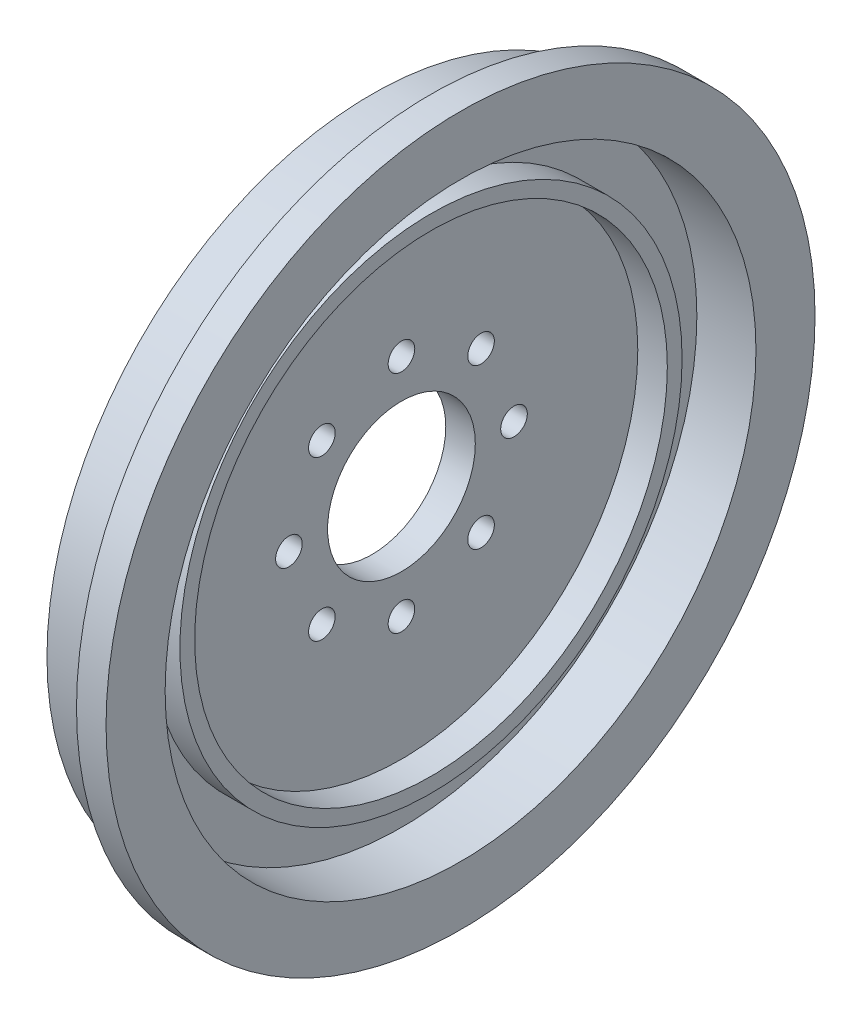
ISO-10303-21;
HEADER;
FILE_DESCRIPTION(('STEP AP214'),'2;1');
FILE_NAME('part.step','',(''),(''),'','','');
FILE_SCHEMA(('AUTOMOTIVE_DESIGN { 1 0 10303 214 1 1 1 1 }'));
ENDSEC;
DATA;
#1=APPLICATION_CONTEXT('core data for automotive mechanical design processes');
#2=APPLICATION_PROTOCOL_DEFINITION('international standard','automotive_design',2000,#1);
#3=PRODUCT_CONTEXT('',#1,'mechanical');
#4=PRODUCT('Part','Part','',(#3));
#5=PRODUCT_RELATED_PRODUCT_CATEGORY('part','',(#4));
#6=PRODUCT_DEFINITION_FORMATION('','',#4);
#7=PRODUCT_DEFINITION_CONTEXT('part definition',#1,'design');
#8=PRODUCT_DEFINITION('design','',#6,#7);
#9=PRODUCT_DEFINITION_SHAPE('','',#8);
#10=(LENGTH_UNIT() NAMED_UNIT(*) SI_UNIT(.MILLI.,.METRE.));
#11=(NAMED_UNIT(*) PLANE_ANGLE_UNIT() SI_UNIT($,.RADIAN.));
#12=(NAMED_UNIT(*) SI_UNIT($,.STERADIAN.) SOLID_ANGLE_UNIT());
#13=UNCERTAINTY_MEASURE_WITH_UNIT(LENGTH_MEASURE(1.E-05),#10,'distance_accuracy_value','');
#14=(GEOMETRIC_REPRESENTATION_CONTEXT(3) GLOBAL_UNCERTAINTY_ASSIGNED_CONTEXT((#13)) GLOBAL_UNIT_ASSIGNED_CONTEXT((#10,
#11,#12)) REPRESENTATION_CONTEXT('',''));
#15=CARTESIAN_POINT('',(0.,0.,0.));
#16=DIRECTION('',(0.,0.,1.));
#17=DIRECTION('',(1.,0.,0.));
#18=AXIS2_PLACEMENT_3D('',#15,#16,#17);
#19=CARTESIAN_POINT('',(0.,0.,0.));
#20=DIRECTION('',(1.,0.,0.));
#21=DIRECTION('',(0.,0.,-1.));
#22=AXIS2_PLACEMENT_3D('',#19,#20,#21);
#23=PLANE('',#22);
#24=CARTESIAN_POINT('',(0.,26.9407683632078,26.9407683632071));
#25=DIRECTION('',(1.,0.,0.));
#26=DIRECTION('',(0.,0.,-1.));
#27=AXIS2_PLACEMENT_3D('',#24,#25,#26);
#28=CIRCLE('',#27,4.49999999999999);
#29=CARTESIAN_POINT('',(0.,26.9407683632078,22.4407683632071));
#30=VERTEX_POINT('',#29);
#31=EDGE_CURVE('E81',#30,#30,#28,.T.);
#32=ORIENTED_EDGE('',*,*,#31,.T.);
#33=EDGE_LOOP('',(#32));
#34=FACE_BOUND('',#33,.T.);
#35=CARTESIAN_POINT('',(0.,26.9407683632074,-26.9407683632075));
#36=DIRECTION('',(1.,0.,0.));
#37=DIRECTION('',(0.,0.,-1.));
#38=AXIS2_PLACEMENT_3D('',#35,#36,#37);
#39=CIRCLE('',#38,4.5);
#40=CARTESIAN_POINT('',(0.,26.9407683632074,-31.4407683632075));
#41=VERTEX_POINT('',#40);
#42=EDGE_CURVE('E123',#41,#41,#39,.T.);
#43=ORIENTED_EDGE('',*,*,#42,.T.);
#44=EDGE_LOOP('',(#43));
#45=FACE_BOUND('',#44,.T.);
#46=CARTESIAN_POINT('',(0.,3.9907631702977E-13,38.1));
#47=DIRECTION('',(1.,0.,0.));
#48=DIRECTION('',(0.,0.,-1.));
#49=AXIS2_PLACEMENT_3D('',#46,#47,#48);
#50=CIRCLE('',#49,4.5);
#51=CARTESIAN_POINT('',(0.,3.9907631702977E-13,33.6));
#52=VERTEX_POINT('',#51);
#53=EDGE_CURVE('E132',#52,#52,#50,.T.);
#54=ORIENTED_EDGE('',*,*,#53,.T.);
#55=EDGE_LOOP('',(#54));
#56=FACE_BOUND('',#55,.T.);
#57=CARTESIAN_POINT('',(0.,-26.9407683632072,26.9407683632077));
#58=DIRECTION('',(1.,0.,0.));
#59=DIRECTION('',(0.,0.,-1.));
#60=AXIS2_PLACEMENT_3D('',#57,#58,#59);
#61=CIRCLE('',#60,4.5);
#62=CARTESIAN_POINT('',(0.,-26.9407683632072,22.4407683632077));
#63=VERTEX_POINT('',#62);
#64=EDGE_CURVE('E140',#63,#63,#61,.T.);
#65=ORIENTED_EDGE('',*,*,#64,.T.);
#66=EDGE_LOOP('',(#65));
#67=FACE_BOUND('',#66,.T.);
#68=CARTESIAN_POINT('',(0.,-38.1,2.66050878019847E-13));
#69=DIRECTION('',(1.,0.,0.));
#70=DIRECTION('',(0.,0.,-1.));
#71=AXIS2_PLACEMENT_3D('',#68,#69,#70);
#72=CIRCLE('',#71,4.5);
#73=CARTESIAN_POINT('',(0.,-38.1,-4.49999999999973));
#74=VERTEX_POINT('',#73);
#75=EDGE_CURVE('E91',#74,#74,#72,.T.);
#76=ORIENTED_EDGE('',*,*,#75,.T.);
#77=EDGE_LOOP('',(#76));
#78=FACE_BOUND('',#77,.T.);
#79=CARTESIAN_POINT('',(0.,-26.9407683632076,-26.9407683632073));
#80=DIRECTION('',(1.,0.,0.));
#81=DIRECTION('',(0.,0.,-1.));
#82=AXIS2_PLACEMENT_3D('',#79,#80,#81);
#83=CIRCLE('',#82,4.5);
#84=CARTESIAN_POINT('',(0.,-26.9407683632076,-31.4407683632073));
#85=VERTEX_POINT('',#84);
#86=EDGE_CURVE('E100',#85,#85,#83,.T.);
#87=ORIENTED_EDGE('',*,*,#86,.T.);
#88=EDGE_LOOP('',(#87));
#89=FACE_BOUND('',#88,.T.);
#90=CARTESIAN_POINT('',(0.,-1.33025439009923E-13,-38.1));
#91=DIRECTION('',(1.,0.,0.));
#92=DIRECTION('',(0.,0.,-1.));
#93=AXIS2_PLACEMENT_3D('',#90,#91,#92);
#94=CIRCLE('',#93,4.5);
#95=CARTESIAN_POINT('',(0.,-1.33025439009923E-13,-42.6));
#96=VERTEX_POINT('',#95);
#97=EDGE_CURVE('E108',#96,#96,#94,.T.);
#98=ORIENTED_EDGE('',*,*,#97,.T.);
#99=EDGE_LOOP('',(#98));
#100=FACE_BOUND('',#99,.T.);
#101=CARTESIAN_POINT('',(0.,38.1,0.));
#102=DIRECTION('',(1.,0.,0.));
#103=DIRECTION('',(0.,0.,-1.));
#104=AXIS2_PLACEMENT_3D('',#101,#102,#103);
#105=CIRCLE('',#104,4.5);
#106=CARTESIAN_POINT('',(0.,38.1,-4.5));
#107=VERTEX_POINT('',#106);
#108=EDGE_CURVE('E116',#107,#107,#105,.T.);
#109=ORIENTED_EDGE('',*,*,#108,.T.);
#110=EDGE_LOOP('',(#109));
#111=FACE_BOUND('',#110,.T.);
#112=CARTESIAN_POINT('',(0.,0.,0.));
#113=DIRECTION('',(1.,0.,0.));
#114=DIRECTION('',(0.,0.,-1.));
#115=AXIS2_PLACEMENT_3D('',#112,#113,#114);
#116=CIRCLE('',#115,25.);
#117=CARTESIAN_POINT('',(0.,0.,-25.));
#118=VERTEX_POINT('',#117);
#119=EDGE_CURVE('E128',#118,#118,#116,.T.);
#120=ORIENTED_EDGE('',*,*,#119,.T.);
#121=EDGE_LOOP('',(#120));
#122=FACE_BOUND('',#121,.T.);
#123=CARTESIAN_POINT('',(0.,0.,0.));
#124=DIRECTION('',(1.,0.,0.));
#125=DIRECTION('',(0.,0.,-1.));
#126=AXIS2_PLACEMENT_3D('',#123,#124,#125);
#127=CIRCLE('',#126,110.);
#128=CARTESIAN_POINT('',(0.,0.,-110.));
#129=VERTEX_POINT('',#128);
#130=EDGE_CURVE('E170',#129,#129,#127,.T.);
#131=ORIENTED_EDGE('',*,*,#130,.F.);
#132=EDGE_LOOP('',(#131));
#133=FACE_BOUND('',#132,.T.);
#134=ADVANCED_FACE('F58',(#34,#45,#56,#67,#78,#89,#100,#111,#122,#133),#23,.F.);
#135=CARTESIAN_POINT('',(10.,0.,0.));
#136=DIRECTION('',(1.,0.,0.));
#137=DIRECTION('',(0.,0.,-1.));
#138=AXIS2_PLACEMENT_3D('',#135,#136,#137);
#139=PLANE('',#138);
#140=CARTESIAN_POINT('',(10.,26.9407683632078,26.9407683632071));
#141=DIRECTION('',(1.,0.,0.));
#142=DIRECTION('',(0.,0.,-1.));
#143=AXIS2_PLACEMENT_3D('',#140,#141,#142);
#144=CIRCLE('',#143,4.49999999999999);
#145=CARTESIAN_POINT('',(10.,26.9407683632078,22.4407683632071));
#146=VERTEX_POINT('',#145);
#147=EDGE_CURVE('E83',#146,#146,#144,.T.);
#148=ORIENTED_EDGE('',*,*,#147,.F.);
#149=EDGE_LOOP('',(#148));
#150=FACE_BOUND('',#149,.T.);
#151=CARTESIAN_POINT('',(10.,26.9407683632074,-26.9407683632075));
#152=DIRECTION('',(1.,0.,0.));
#153=DIRECTION('',(0.,0.,-1.));
#154=AXIS2_PLACEMENT_3D('',#151,#152,#153);
#155=CIRCLE('',#154,4.5);
#156=CARTESIAN_POINT('',(10.,26.9407683632074,-31.4407683632075));
#157=VERTEX_POINT('',#156);
#158=EDGE_CURVE('E127',#157,#157,#155,.T.);
#159=ORIENTED_EDGE('',*,*,#158,.F.);
#160=EDGE_LOOP('',(#159));
#161=FACE_BOUND('',#160,.T.);
#162=CARTESIAN_POINT('',(10.,3.9907631702977E-13,38.1));
#163=DIRECTION('',(1.,0.,0.));
#164=DIRECTION('',(0.,0.,-1.));
#165=AXIS2_PLACEMENT_3D('',#162,#163,#164);
#166=CIRCLE('',#165,4.5);
#167=CARTESIAN_POINT('',(10.,3.9907631702977E-13,33.6));
#168=VERTEX_POINT('',#167);
#169=EDGE_CURVE('E136',#168,#168,#166,.T.);
#170=ORIENTED_EDGE('',*,*,#169,.F.);
#171=EDGE_LOOP('',(#170));
#172=FACE_BOUND('',#171,.T.);
#173=CARTESIAN_POINT('',(10.,-26.9407683632072,26.9407683632077));
#174=DIRECTION('',(1.,0.,0.));
#175=DIRECTION('',(0.,0.,-1.));
#176=AXIS2_PLACEMENT_3D('',#173,#174,#175);
#177=CIRCLE('',#176,4.5);
#178=CARTESIAN_POINT('',(10.,-26.9407683632072,22.4407683632077));
#179=VERTEX_POINT('',#178);
#180=EDGE_CURVE('E96',#179,#179,#177,.T.);
#181=ORIENTED_EDGE('',*,*,#180,.F.);
#182=EDGE_LOOP('',(#181));
#183=FACE_BOUND('',#182,.T.);
#184=CARTESIAN_POINT('',(10.,-38.1,2.66050878019847E-13));
#185=DIRECTION('',(1.,0.,0.));
#186=DIRECTION('',(0.,0.,-1.));
#187=AXIS2_PLACEMENT_3D('',#184,#185,#186);
#188=CIRCLE('',#187,4.5);
#189=CARTESIAN_POINT('',(10.,-38.1,-4.49999999999973));
#190=VERTEX_POINT('',#189);
#191=EDGE_CURVE('E95',#190,#190,#188,.T.);
#192=ORIENTED_EDGE('',*,*,#191,.F.);
#193=EDGE_LOOP('',(#192));
#194=FACE_BOUND('',#193,.T.);
#195=CARTESIAN_POINT('',(10.,-26.9407683632076,-26.9407683632073));
#196=DIRECTION('',(1.,0.,0.));
#197=DIRECTION('',(0.,0.,-1.));
#198=AXIS2_PLACEMENT_3D('',#195,#196,#197);
#199=CIRCLE('',#198,4.5);
#200=CARTESIAN_POINT('',(10.,-26.9407683632076,-31.4407683632073));
#201=VERTEX_POINT('',#200);
#202=EDGE_CURVE('E104',#201,#201,#199,.T.);
#203=ORIENTED_EDGE('',*,*,#202,.F.);
#204=EDGE_LOOP('',(#203));
#205=FACE_BOUND('',#204,.T.);
#206=CARTESIAN_POINT('',(10.,-1.33025439009923E-13,-38.1));
#207=DIRECTION('',(1.,0.,0.));
#208=DIRECTION('',(0.,0.,-1.));
#209=AXIS2_PLACEMENT_3D('',#206,#207,#208);
#210=CIRCLE('',#209,4.5);
#211=CARTESIAN_POINT('',(10.,-1.33025439009923E-13,-42.6));
#212=VERTEX_POINT('',#211);
#213=EDGE_CURVE('E112',#212,#212,#210,.T.);
#214=ORIENTED_EDGE('',*,*,#213,.F.);
#215=EDGE_LOOP('',(#214));
#216=FACE_BOUND('',#215,.T.);
#217=CARTESIAN_POINT('',(10.,38.1,0.));
#218=DIRECTION('',(1.,0.,0.));
#219=DIRECTION('',(0.,0.,-1.));
#220=AXIS2_PLACEMENT_3D('',#217,#218,#219);
#221=CIRCLE('',#220,4.5);
#222=CARTESIAN_POINT('',(10.,38.1,-4.5));
#223=VERTEX_POINT('',#222);
#224=EDGE_CURVE('E87',#223,#223,#221,.T.);
#225=ORIENTED_EDGE('',*,*,#224,.F.);
#226=EDGE_LOOP('',(#225));
#227=FACE_BOUND('',#226,.T.);
#228=CARTESIAN_POINT('',(10.,0.,0.));
#229=DIRECTION('',(1.,0.,0.));
#230=DIRECTION('',(0.,0.,-1.));
#231=AXIS2_PLACEMENT_3D('',#228,#229,#230);
#232=CIRCLE('',#231,25.);
#233=CARTESIAN_POINT('',(10.,0.,-25.));
#234=VERTEX_POINT('',#233);
#235=EDGE_CURVE('E147',#234,#234,#232,.T.);
#236=ORIENTED_EDGE('',*,*,#235,.F.);
#237=EDGE_LOOP('',(#236));
#238=FACE_BOUND('',#237,.T.);
#239=CARTESIAN_POINT('',(10.,0.,0.));
#240=DIRECTION('',(1.,0.,0.));
#241=DIRECTION('',(0.,0.,-1.));
#242=AXIS2_PLACEMENT_3D('',#239,#240,#241);
#243=CIRCLE('',#242,80.);
#244=CARTESIAN_POINT('',(10.,0.,-80.));
#245=VERTEX_POINT('',#244);
#246=EDGE_CURVE('E11',#245,#245,#243,.F.);
#247=ORIENTED_EDGE('',*,*,#246,.F.);
#248=EDGE_LOOP('',(#247));
#249=FACE_BOUND('',#248,.T.);
#250=ADVANCED_FACE('F183',(#150,#161,#172,#183,#194,#205,#216,#227,#238,#249),#139,.T.);
#251=CARTESIAN_POINT('',(30.,0.,0.));
#252=DIRECTION('',(-1.,0.,0.));
#253=DIRECTION('',(0.,0.,1.));
#254=AXIS2_PLACEMENT_3D('',#251,#252,#253);
#255=CYLINDRICAL_SURFACE('',#254,120.);
#256=CARTESIAN_POINT('',(20.,0.,0.));
#257=DIRECTION('',(1.,0.,0.));
#258=DIRECTION('',(0.,0.,-1.));
#259=AXIS2_PLACEMENT_3D('',#256,#257,#258);
#260=CIRCLE('',#259,120.);
#261=CARTESIAN_POINT('',(20.,0.,-120.));
#262=VERTEX_POINT('',#261);
#263=EDGE_CURVE('E166',#262,#262,#260,.T.);
#264=ORIENTED_EDGE('',*,*,#263,.T.);
#265=EDGE_LOOP('',(#264));
#266=FACE_BOUND('',#265,.T.);
#267=CARTESIAN_POINT('',(30.,0.,0.));
#268=DIRECTION('',(1.,0.,0.));
#269=DIRECTION('',(0.,0.,-1.));
#270=AXIS2_PLACEMENT_3D('',#267,#268,#269);
#271=CIRCLE('',#270,120.);
#272=CARTESIAN_POINT('',(30.,0.,-120.));
#273=VERTEX_POINT('',#272);
#274=EDGE_CURVE('E66',#273,#273,#271,.T.);
#275=ORIENTED_EDGE('',*,*,#274,.F.);
#276=EDGE_LOOP('',(#275));
#277=FACE_BOUND('',#276,.T.);
#278=ADVANCED_FACE('F60',(#266,#277),#255,.T.);
#279=CARTESIAN_POINT('',(30.,0.,0.));
#280=DIRECTION('',(1.,0.,0.));
#281=DIRECTION('',(0.,0.,-1.));
#282=AXIS2_PLACEMENT_3D('',#279,#280,#281);
#283=PLANE('',#282);
#284=CARTESIAN_POINT('',(30.,0.,0.));
#285=DIRECTION('',(1.,0.,0.));
#286=DIRECTION('',(0.,0.,-1.));
#287=AXIS2_PLACEMENT_3D('',#284,#285,#286);
#288=CIRCLE('',#287,100.);
#289=CARTESIAN_POINT('',(30.,0.,-100.));
#290=VERTEX_POINT('',#289);
#291=EDGE_CURVE('E76',#290,#290,#288,.T.);
#292=ORIENTED_EDGE('',*,*,#291,.F.);
#293=EDGE_LOOP('',(#292));
#294=FACE_BOUND('',#293,.T.);
#295=ORIENTED_EDGE('',*,*,#274,.T.);
#296=EDGE_LOOP('',(#295));
#297=FACE_BOUND('',#296,.T.);
#298=ADVANCED_FACE('F195',(#294,#297),#283,.T.);
#299=CARTESIAN_POINT('',(10.,0.,0.));
#300=DIRECTION('',(1.,0.,0.));
#301=DIRECTION('',(0.,0.,-1.));
#302=AXIS2_PLACEMENT_3D('',#299,#300,#301);
#303=CYLINDRICAL_SURFACE('',#302,100.);
#304=CARTESIAN_POINT('',(10.,0.,0.));
#305=DIRECTION('',(1.,0.,0.));
#306=DIRECTION('',(0.,0.,-1.));
#307=AXIS2_PLACEMENT_3D('',#304,#305,#306);
#308=CIRCLE('',#307,100.);
#309=CARTESIAN_POINT('',(10.,0.,-100.));
#310=VERTEX_POINT('',#309);
#311=EDGE_CURVE('E71',#310,#310,#308,.T.);
#312=ORIENTED_EDGE('',*,*,#311,.F.);
#313=EDGE_LOOP('',(#312));
#314=FACE_BOUND('',#313,.T.);
#315=ORIENTED_EDGE('',*,*,#291,.T.);
#316=EDGE_LOOP('',(#315));
#317=FACE_BOUND('',#316,.T.);
#318=ADVANCED_FACE('F198',(#314,#317),#303,.F.);
#319=CARTESIAN_POINT('',(10.,0.,0.));
#320=DIRECTION('',(1.,0.,0.));
#321=DIRECTION('',(0.,0.,-1.));
#322=AXIS2_PLACEMENT_3D('',#319,#320,#321);
#323=CIRCLE('',#322,85.);
#324=CARTESIAN_POINT('',(10.,0.,-85.));
#325=VERTEX_POINT('',#324);
#326=EDGE_CURVE('E155',#325,#325,#323,.T.);
#327=ORIENTED_EDGE('',*,*,#326,.F.);
#328=EDGE_LOOP('',(#327));
#329=FACE_BOUND('',#328,.T.);
#330=ORIENTED_EDGE('',*,*,#311,.T.);
#331=EDGE_LOOP('',(#330));
#332=FACE_BOUND('',#331,.T.);
#333=ADVANCED_FACE('F192',(#329,#332),#139,.T.);
#334=CARTESIAN_POINT('',(0.,26.9407683632078,26.9407683632071));
#335=DIRECTION('',(1.,0.,0.));
#336=DIRECTION('',(0.,0.,-1.));
#337=AXIS2_PLACEMENT_3D('',#334,#335,#336);
#338=CYLINDRICAL_SURFACE('',#337,4.49999999999999);
#339=ORIENTED_EDGE('',*,*,#31,.F.);
#340=EDGE_LOOP('',(#339));
#341=FACE_BOUND('',#340,.T.);
#342=ORIENTED_EDGE('',*,*,#147,.T.);
#343=EDGE_LOOP('',(#342));
#344=FACE_BOUND('',#343,.T.);
#345=ADVANCED_FACE('F204',(#341,#344),#338,.F.);
#346=CARTESIAN_POINT('',(0.,26.9407683632074,-26.9407683632075));
#347=DIRECTION('',(1.,0.,0.));
#348=DIRECTION('',(0.,0.,-1.));
#349=AXIS2_PLACEMENT_3D('',#346,#347,#348);
#350=CYLINDRICAL_SURFACE('',#349,4.5);
#351=ORIENTED_EDGE('',*,*,#158,.T.);
#352=EDGE_LOOP('',(#351));
#353=FACE_BOUND('',#352,.T.);
#354=ORIENTED_EDGE('',*,*,#42,.F.);
#355=EDGE_LOOP('',(#354));
#356=FACE_BOUND('',#355,.T.);
#357=ADVANCED_FACE('F208',(#353,#356),#350,.F.);
#358=CARTESIAN_POINT('',(0.,3.9907631702977E-13,38.1));
#359=DIRECTION('',(1.,0.,0.));
#360=DIRECTION('',(0.,0.,-1.));
#361=AXIS2_PLACEMENT_3D('',#358,#359,#360);
#362=CYLINDRICAL_SURFACE('',#361,4.5);
#363=ORIENTED_EDGE('',*,*,#53,.F.);
#364=EDGE_LOOP('',(#363));
#365=FACE_BOUND('',#364,.T.);
#366=ORIENTED_EDGE('',*,*,#169,.T.);
#367=EDGE_LOOP('',(#366));
#368=FACE_BOUND('',#367,.T.);
#369=ADVANCED_FACE('F230',(#365,#368),#362,.F.);
#370=CARTESIAN_POINT('',(0.,-26.9407683632072,26.9407683632077));
#371=DIRECTION('',(1.,0.,0.));
#372=DIRECTION('',(0.,0.,-1.));
#373=AXIS2_PLACEMENT_3D('',#370,#371,#372);
#374=CYLINDRICAL_SURFACE('',#373,4.5);
#375=ORIENTED_EDGE('',*,*,#64,.F.);
#376=EDGE_LOOP('',(#375));
#377=FACE_BOUND('',#376,.T.);
#378=ORIENTED_EDGE('',*,*,#180,.T.);
#379=EDGE_LOOP('',(#378));
#380=FACE_BOUND('',#379,.T.);
#381=ADVANCED_FACE('F214',(#377,#380),#374,.F.);
#382=CARTESIAN_POINT('',(0.,-38.1,2.66050878019847E-13));
#383=DIRECTION('',(1.,0.,0.));
#384=DIRECTION('',(0.,0.,-1.));
#385=AXIS2_PLACEMENT_3D('',#382,#383,#384);
#386=CYLINDRICAL_SURFACE('',#385,4.5);
#387=ORIENTED_EDGE('',*,*,#75,.F.);
#388=EDGE_LOOP('',(#387));
#389=FACE_BOUND('',#388,.T.);
#390=ORIENTED_EDGE('',*,*,#191,.T.);
#391=EDGE_LOOP('',(#390));
#392=FACE_BOUND('',#391,.T.);
#393=ADVANCED_FACE('F210',(#389,#392),#386,.F.);
#394=CARTESIAN_POINT('',(0.,-26.9407683632076,-26.9407683632073));
#395=DIRECTION('',(1.,0.,0.));
#396=DIRECTION('',(0.,0.,-1.));
#397=AXIS2_PLACEMENT_3D('',#394,#395,#396);
#398=CYLINDRICAL_SURFACE('',#397,4.5);
#399=ORIENTED_EDGE('',*,*,#86,.F.);
#400=EDGE_LOOP('',(#399));
#401=FACE_BOUND('',#400,.T.);
#402=ORIENTED_EDGE('',*,*,#202,.T.);
#403=EDGE_LOOP('',(#402));
#404=FACE_BOUND('',#403,.T.);
#405=ADVANCED_FACE('F213',(#401,#404),#398,.F.);
#406=CARTESIAN_POINT('',(0.,-1.33025439009923E-13,-38.1));
#407=DIRECTION('',(1.,0.,0.));
#408=DIRECTION('',(0.,0.,-1.));
#409=AXIS2_PLACEMENT_3D('',#406,#407,#408);
#410=CYLINDRICAL_SURFACE('',#409,4.5);
#411=ORIENTED_EDGE('',*,*,#97,.F.);
#412=EDGE_LOOP('',(#411));
#413=FACE_BOUND('',#412,.T.);
#414=ORIENTED_EDGE('',*,*,#213,.T.);
#415=EDGE_LOOP('',(#414));
#416=FACE_BOUND('',#415,.T.);
#417=ADVANCED_FACE('F218',(#413,#416),#410,.F.);
#418=CARTESIAN_POINT('',(0.,38.1,0.));
#419=DIRECTION('',(1.,0.,0.));
#420=DIRECTION('',(0.,0.,-1.));
#421=AXIS2_PLACEMENT_3D('',#418,#419,#420);
#422=CYLINDRICAL_SURFACE('',#421,4.5);
#423=ORIENTED_EDGE('',*,*,#108,.F.);
#424=EDGE_LOOP('',(#423));
#425=FACE_BOUND('',#424,.T.);
#426=ORIENTED_EDGE('',*,*,#224,.T.);
#427=EDGE_LOOP('',(#426));
#428=FACE_BOUND('',#427,.T.);
#429=ADVANCED_FACE('F222',(#425,#428),#422,.F.);
#430=CARTESIAN_POINT('',(0.,0.,0.));
#431=DIRECTION('',(1.,0.,0.));
#432=DIRECTION('',(0.,0.,-1.));
#433=AXIS2_PLACEMENT_3D('',#430,#431,#432);
#434=CYLINDRICAL_SURFACE('',#433,25.);
#435=ORIENTED_EDGE('',*,*,#119,.F.);
#436=EDGE_LOOP('',(#435));
#437=FACE_BOUND('',#436,.T.);
#438=ORIENTED_EDGE('',*,*,#235,.T.);
#439=EDGE_LOOP('',(#438));
#440=FACE_BOUND('',#439,.T.);
#441=ADVANCED_FACE('F226',(#437,#440),#434,.F.);
#442=CARTESIAN_POINT('',(20.,0.,0.));
#443=DIRECTION('',(1.,0.,0.));
#444=DIRECTION('',(0.,0.,-1.));
#445=AXIS2_PLACEMENT_3D('',#442,#443,#444);
#446=PLANE('',#445);
#447=CARTESIAN_POINT('',(20.,0.,0.));
#448=DIRECTION('',(1.,0.,0.));
#449=DIRECTION('',(0.,0.,-1.));
#450=AXIS2_PLACEMENT_3D('',#447,#448,#449);
#451=CIRCLE('',#450,85.);
#452=CARTESIAN_POINT('',(20.,0.,-85.));
#453=VERTEX_POINT('',#452);
#454=EDGE_CURVE('E151',#453,#453,#451,.T.);
#455=ORIENTED_EDGE('',*,*,#454,.T.);
#456=EDGE_LOOP('',(#455));
#457=FACE_BOUND('',#456,.T.);
#458=CARTESIAN_POINT('',(20.,0.,0.));
#459=DIRECTION('',(1.,0.,0.));
#460=DIRECTION('',(0.,0.,-1.));
#461=AXIS2_PLACEMENT_3D('',#458,#459,#460);
#462=CIRCLE('',#461,80.);
#463=CARTESIAN_POINT('',(20.,0.,-80.));
#464=VERTEX_POINT('',#463);
#465=EDGE_CURVE('E159',#464,#464,#462,.T.);
#466=ORIENTED_EDGE('',*,*,#465,.F.);
#467=EDGE_LOOP('',(#466));
#468=FACE_BOUND('',#467,.T.);
#469=ADVANCED_FACE('F240',(#457,#468),#446,.T.);
#470=CARTESIAN_POINT('',(20.,0.,0.));
#471=DIRECTION('',(-1.,0.,0.));
#472=DIRECTION('',(0.,0.,1.));
#473=AXIS2_PLACEMENT_3D('',#470,#471,#472);
#474=CYLINDRICAL_SURFACE('',#473,85.);
#475=ORIENTED_EDGE('',*,*,#454,.F.);
#476=EDGE_LOOP('',(#475));
#477=FACE_BOUND('',#476,.T.);
#478=ORIENTED_EDGE('',*,*,#326,.T.);
#479=EDGE_LOOP('',(#478));
#480=FACE_BOUND('',#479,.T.);
#481=ADVANCED_FACE('F242',(#477,#480),#474,.T.);
#482=CARTESIAN_POINT('',(20.,0.,0.));
#483=DIRECTION('',(-1.,0.,0.));
#484=DIRECTION('',(0.,0.,1.));
#485=AXIS2_PLACEMENT_3D('',#482,#483,#484);
#486=CYLINDRICAL_SURFACE('',#485,80.);
#487=ORIENTED_EDGE('',*,*,#465,.T.);
#488=EDGE_LOOP('',(#487));
#489=FACE_BOUND('',#488,.T.);
#490=ORIENTED_EDGE('',*,*,#246,.T.);
#491=EDGE_LOOP('',(#490));
#492=FACE_BOUND('',#491,.T.);
#493=ADVANCED_FACE('F245',(#489,#492),#486,.F.);
#494=CARTESIAN_POINT('',(20.,0.,0.));
#495=DIRECTION('',(1.,0.,0.));
#496=DIRECTION('',(0.,0.,-1.));
#497=AXIS2_PLACEMENT_3D('',#494,#495,#496);
#498=PLANE('',#497);
#499=CARTESIAN_POINT('',(20.,0.,0.));
#500=DIRECTION('',(1.,0.,0.));
#501=DIRECTION('',(0.,0.,-1.));
#502=AXIS2_PLACEMENT_3D('',#499,#500,#501);
#503=CIRCLE('',#502,110.);
#504=CARTESIAN_POINT('',(20.,0.,-110.));
#505=VERTEX_POINT('',#504);
#506=EDGE_CURVE('E171',#505,#505,#503,.T.);
#507=ORIENTED_EDGE('',*,*,#506,.T.);
#508=EDGE_LOOP('',(#507));
#509=FACE_BOUND('',#508,.T.);
#510=ORIENTED_EDGE('',*,*,#263,.F.);
#511=EDGE_LOOP('',(#510));
#512=FACE_BOUND('',#511,.T.);
#513=ADVANCED_FACE('F251',(#509,#512),#498,.F.);
#514=CARTESIAN_POINT('',(0.,0.,0.));
#515=DIRECTION('',(1.,0.,0.));
#516=DIRECTION('',(0.,0.,-1.));
#517=AXIS2_PLACEMENT_3D('',#514,#515,#516);
#518=CYLINDRICAL_SURFACE('',#517,110.);
#519=ORIENTED_EDGE('',*,*,#130,.T.);
#520=EDGE_LOOP('',(#519));
#521=FACE_BOUND('',#520,.T.);
#522=ORIENTED_EDGE('',*,*,#506,.F.);
#523=EDGE_LOOP('',(#522));
#524=FACE_BOUND('',#523,.T.);
#525=ADVANCED_FACE('F179',(#521,#524),#518,.T.);
#526=CLOSED_SHELL('',(#134,#250,#278,#298,#318,#333,#345,#357,#369,#381,#393,#405,#417,#429,
#441,#469,#481,#493,#513,#525));
#527=MANIFOLD_SOLID_BREP('B2',#526);
#528=ADVANCED_BREP_SHAPE_REPRESENTATION('',(#18,#527),#14);
#529=SHAPE_DEFINITION_REPRESENTATION(#9,#528);
ENDSEC;
END-ISO-10303-21;
